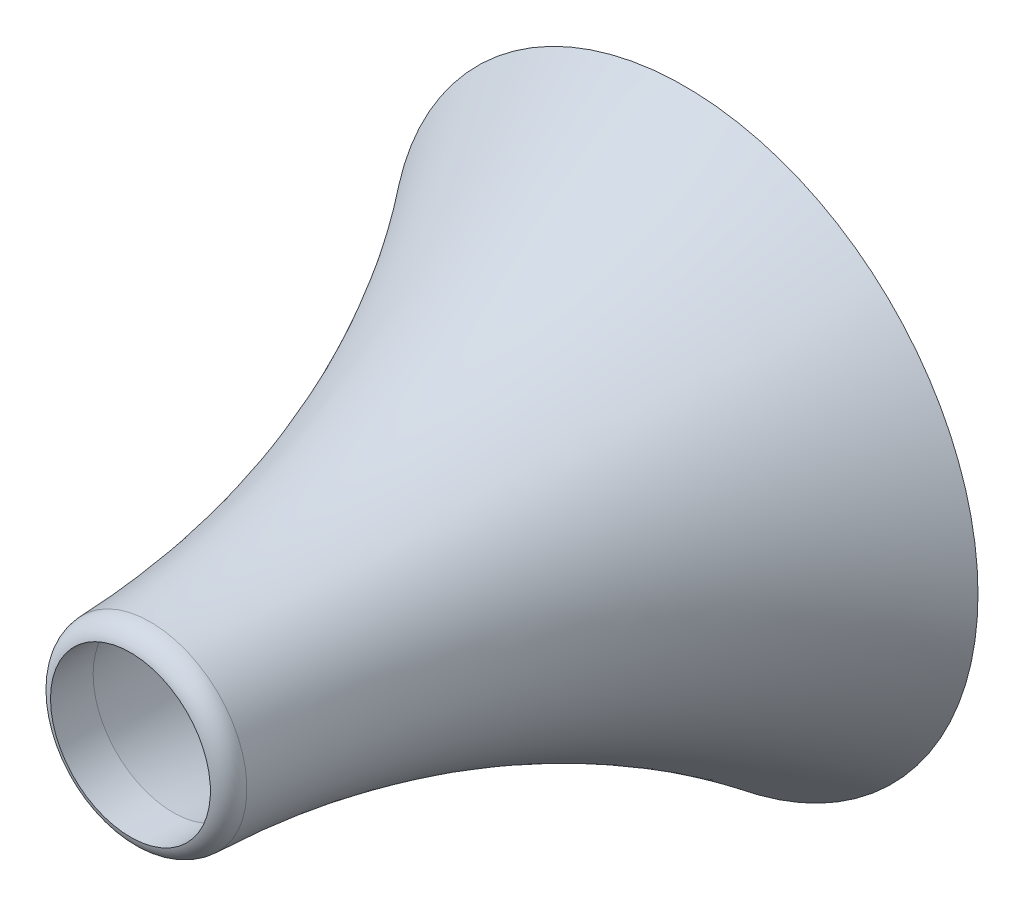
ISO-10303-21;
HEADER;
FILE_DESCRIPTION(('STEP AP214'),'2;1');
FILE_NAME('part.step','',(''),(''),'','','');
FILE_SCHEMA(('AUTOMOTIVE_DESIGN { 1 0 10303 214 1 1 1 1 }'));
ENDSEC;
DATA;
#1=APPLICATION_CONTEXT('core data for automotive mechanical design processes');
#2=APPLICATION_PROTOCOL_DEFINITION('international standard','automotive_design',2000,#1);
#3=PRODUCT_CONTEXT('',#1,'mechanical');
#4=PRODUCT('Part','Part','',(#3));
#5=PRODUCT_RELATED_PRODUCT_CATEGORY('part','',(#4));
#6=PRODUCT_DEFINITION_FORMATION('','',#4);
#7=PRODUCT_DEFINITION_CONTEXT('part definition',#1,'design');
#8=PRODUCT_DEFINITION('design','',#6,#7);
#9=PRODUCT_DEFINITION_SHAPE('','',#8);
#10=(LENGTH_UNIT() NAMED_UNIT(*) SI_UNIT(.MILLI.,.METRE.));
#11=(NAMED_UNIT(*) PLANE_ANGLE_UNIT() SI_UNIT($,.RADIAN.));
#12=(NAMED_UNIT(*) SI_UNIT($,.STERADIAN.) SOLID_ANGLE_UNIT());
#13=UNCERTAINTY_MEASURE_WITH_UNIT(LENGTH_MEASURE(1.E-05),#10,'distance_accuracy_value','');
#14=(GEOMETRIC_REPRESENTATION_CONTEXT(3) GLOBAL_UNCERTAINTY_ASSIGNED_CONTEXT((#13)) GLOBAL_UNIT_ASSIGNED_CONTEXT((#10,
#11,#12)) REPRESENTATION_CONTEXT('',''));
#15=CARTESIAN_POINT('',(0.,0.,0.));
#16=DIRECTION('',(0.,0.,1.));
#17=DIRECTION('',(1.,0.,0.));
#18=AXIS2_PLACEMENT_3D('',#15,#16,#17);
#19=CARTESIAN_POINT('',(-55.,0.,0.));
#20=CARTESIAN_POINT('',(-18.7451166593604,0.,47.0080086682662));
#21=CARTESIAN_POINT('',(-18.,0.,104.));
#22=B_SPLINE_CURVE_WITH_KNOTS('',2,(#19,#20,#21),.UNSPECIFIED.,.F.,.F.,(3,3),(0.,1.),.UNSPECIFIED.);
#23=CARTESIAN_POINT('',(0.,0.,-34.5868395387325));
#24=DIRECTION('',(0.,0.,-1.));
#25=AXIS1_PLACEMENT('',#23,#24);
#26=SURFACE_OF_REVOLUTION('',#22,#25);
#27=CARTESIAN_POINT('',(0.,0.,100.240232309163));
#28=DIRECTION('',(0.,0.,-1.));
#29=DIRECTION('',(-1.,0.,0.));
#30=AXIS2_PLACEMENT_3D('',#27,#28,#29);
#31=CIRCLE('',#30,18.0881582587064);
#32=CARTESIAN_POINT('',(-18.0881582587064,0.,100.240232309163));
#33=VERTEX_POINT('',#32);
#34=EDGE_CURVE('E10',#33,#33,#31,.T.);
#35=ORIENTED_EDGE('',*,*,#34,.T.);
#36=EDGE_LOOP('',(#35));
#37=FACE_BOUND('',#36,.T.);
#38=CARTESIAN_POINT('',(0.,0.,0.));
#39=DIRECTION('',(0.,0.,-1.));
#40=DIRECTION('',(-1.,0.,0.));
#41=AXIS2_PLACEMENT_3D('',#38,#39,#40);
#42=CIRCLE('',#41,55.);
#43=CARTESIAN_POINT('',(-55.,0.,0.));
#44=VERTEX_POINT('',#43);
#45=EDGE_CURVE('E60',#44,#44,#42,.T.);
#46=ORIENTED_EDGE('',*,*,#45,.F.);
#47=EDGE_LOOP('',(#46));
#48=FACE_BOUND('',#47,.T.);
#49=ADVANCED_FACE('F34',(#37,#48),#26,.F.);
#50=CARTESIAN_POINT('',(0.,0.,-34.5868395387325));
#51=DIRECTION('',(0.,0.,-1.));
#52=DIRECTION('',(-1.,0.,0.));
#53=AXIS2_PLACEMENT_3D('',#50,#51,#52);
#54=CYLINDRICAL_SURFACE('',#53,15.);
#55=CARTESIAN_POINT('',(0.,0.,96.));
#56=DIRECTION('',(0.,0.,-1.));
#57=DIRECTION('',(-1.,0.,0.));
#58=AXIS2_PLACEMENT_3D('',#55,#56,#57);
#59=CIRCLE('',#58,15.);
#60=CARTESIAN_POINT('',(-15.,0.,96.));
#61=VERTEX_POINT('',#60);
#62=EDGE_CURVE('E45',#61,#61,#59,.T.);
#63=ORIENTED_EDGE('',*,*,#62,.T.);
#64=EDGE_LOOP('',(#63));
#65=FACE_BOUND('',#64,.T.);
#66=CARTESIAN_POINT('',(0.,0.,104.));
#67=DIRECTION('',(0.,0.,-1.));
#68=DIRECTION('',(-1.,0.,0.));
#69=AXIS2_PLACEMENT_3D('',#66,#67,#68);
#70=CIRCLE('',#69,15.);
#71=CARTESIAN_POINT('',(-15.,0.,104.));
#72=VERTEX_POINT('',#71);
#73=EDGE_CURVE('E41',#72,#72,#70,.T.);
#74=ORIENTED_EDGE('',*,*,#73,.F.);
#75=EDGE_LOOP('',(#74));
#76=FACE_BOUND('',#75,.T.);
#77=ADVANCED_FACE('F79',(#65,#76),#54,.F.);
#78=CARTESIAN_POINT('',(-15.,0.,96.));
#79=CARTESIAN_POINT('',(-20.1246498850267,0.,45.4418544267234));
#80=CARTESIAN_POINT('',(-48.,0.,4.));
#81=B_SPLINE_CURVE_WITH_KNOTS('',2,(#78,#79,#80),.UNSPECIFIED.,.F.,.F.,(3,3),(0.,1.),.UNSPECIFIED.);
#82=CARTESIAN_POINT('',(0.,0.,-34.5868395387325));
#83=DIRECTION('',(0.,0.,-1.));
#84=AXIS1_PLACEMENT('',#82,#83);
#85=SURFACE_OF_REVOLUTION('',#81,#84);
#86=CARTESIAN_POINT('',(0.,0.,4.));
#87=DIRECTION('',(0.,0.,-1.));
#88=DIRECTION('',(-1.,0.,0.));
#89=AXIS2_PLACEMENT_3D('',#86,#87,#88);
#90=CIRCLE('',#89,48.);
#91=CARTESIAN_POINT('',(-48.,0.,4.));
#92=VERTEX_POINT('',#91);
#93=EDGE_CURVE('E49',#92,#92,#90,.T.);
#94=ORIENTED_EDGE('',*,*,#93,.T.);
#95=EDGE_LOOP('',(#94));
#96=FACE_BOUND('',#95,.T.);
#97=ORIENTED_EDGE('',*,*,#62,.F.);
#98=EDGE_LOOP('',(#97));
#99=FACE_BOUND('',#98,.T.);
#100=ADVANCED_FACE('F74',(#96,#99),#85,.F.);
#101=CARTESIAN_POINT('',(-40.,0.,4.00000000000001));
#102=DIRECTION('',(0.,0.,1.));
#103=DIRECTION('',(1.,0.,0.));
#104=AXIS2_PLACEMENT_3D('',#101,#102,#103);
#105=PLANE('',#104);
#106=CARTESIAN_POINT('',(0.,0.,4.));
#107=DIRECTION('',(0.,0.,-1.));
#108=DIRECTION('',(-1.,0.,0.));
#109=AXIS2_PLACEMENT_3D('',#106,#107,#108);
#110=CIRCLE('',#109,40.);
#111=CARTESIAN_POINT('',(-40.,0.,4.));
#112=VERTEX_POINT('',#111);
#113=EDGE_CURVE('E54',#112,#112,#110,.T.);
#114=ORIENTED_EDGE('',*,*,#113,.T.);
#115=EDGE_LOOP('',(#114));
#116=FACE_BOUND('',#115,.T.);
#117=ORIENTED_EDGE('',*,*,#93,.F.);
#118=EDGE_LOOP('',(#117));
#119=FACE_BOUND('',#118,.T.);
#120=ADVANCED_FACE('F78',(#116,#119),#105,.T.);
#121=CARTESIAN_POINT('',(0.,0.,-34.5868395387325));
#122=DIRECTION('',(0.,0.,-1.));
#123=DIRECTION('',(-1.,0.,0.));
#124=AXIS2_PLACEMENT_3D('',#121,#122,#123);
#125=CYLINDRICAL_SURFACE('',#124,40.);
#126=CARTESIAN_POINT('',(0.,0.,0.));
#127=DIRECTION('',(0.,0.,-1.));
#128=DIRECTION('',(-1.,0.,0.));
#129=AXIS2_PLACEMENT_3D('',#126,#127,#128);
#130=CIRCLE('',#129,40.);
#131=CARTESIAN_POINT('',(-40.,0.,0.));
#132=VERTEX_POINT('',#131);
#133=EDGE_CURVE('E57',#132,#132,#130,.T.);
#134=ORIENTED_EDGE('',*,*,#133,.T.);
#135=EDGE_LOOP('',(#134));
#136=FACE_BOUND('',#135,.T.);
#137=ORIENTED_EDGE('',*,*,#113,.F.);
#138=EDGE_LOOP('',(#137));
#139=FACE_BOUND('',#138,.T.);
#140=ADVANCED_FACE('F93',(#136,#139),#125,.F.);
#141=CARTESIAN_POINT('',(-40.,0.,0.));
#142=DIRECTION('',(0.,0.,-1.));
#143=DIRECTION('',(-1.,0.,0.));
#144=AXIS2_PLACEMENT_3D('',#141,#142,#143);
#145=PLANE('',#144);
#146=ORIENTED_EDGE('',*,*,#45,.T.);
#147=EDGE_LOOP('',(#146));
#148=FACE_BOUND('',#147,.T.);
#149=ORIENTED_EDGE('',*,*,#133,.F.);
#150=EDGE_LOOP('',(#149));
#151=FACE_BOUND('',#150,.T.);
#152=ADVANCED_FACE('F90',(#148,#151),#145,.T.);
#153=CARTESIAN_POINT('',(0.,0.,100.104782045303));
#154=DIRECTION('',(0.,0.,-1.));
#155=DIRECTION('',(-1.,0.,0.));
#156=AXIS2_PLACEMENT_3D('',#153,#154,#155);
#157=TOROIDAL_SURFACE('',#156,14.090452263261,4.);
#158=ORIENTED_EDGE('',*,*,#73,.T.);
#159=EDGE_LOOP('',(#158));
#160=FACE_BOUND('',#159,.T.);
#161=ORIENTED_EDGE('',*,*,#34,.F.);
#162=EDGE_LOOP('',(#161));
#163=FACE_BOUND('',#162,.T.);
#164=ADVANCED_FACE('F36',(#160,#163),#157,.T.);
#165=CLOSED_SHELL('',(#49,#77,#100,#120,#140,#152,#164));
#166=MANIFOLD_SOLID_BREP('B2',#165);
#167=ADVANCED_BREP_SHAPE_REPRESENTATION('',(#18,#166),#14);
#168=SHAPE_DEFINITION_REPRESENTATION(#9,#167);
ENDSEC;
END-ISO-10303-21;
